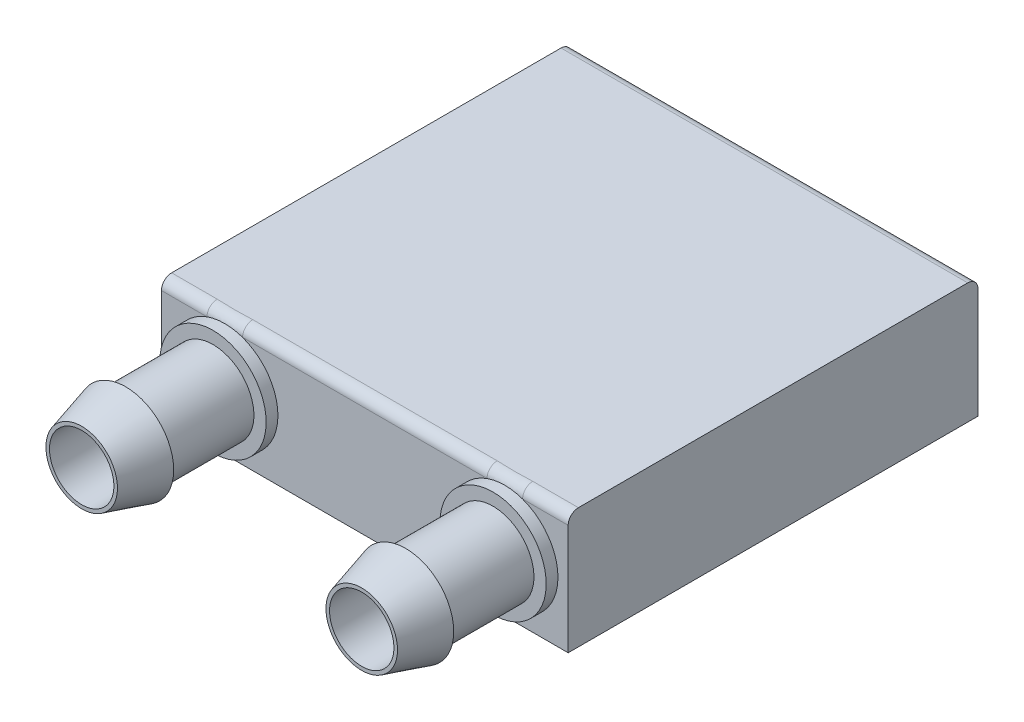
ISO-10303-21;
HEADER;
FILE_DESCRIPTION(('STEP AP214'),'2;1');
FILE_NAME('part.step','',(''),(''),'','','');
FILE_SCHEMA(('AUTOMOTIVE_DESIGN { 1 0 10303 214 1 1 1 1 }'));
ENDSEC;
DATA;
#1=APPLICATION_CONTEXT('core data for automotive mechanical design processes');
#2=APPLICATION_PROTOCOL_DEFINITION('international standard','automotive_design',2000,#1);
#3=PRODUCT_CONTEXT('',#1,'mechanical');
#4=PRODUCT('Part','Part','',(#3));
#5=PRODUCT_RELATED_PRODUCT_CATEGORY('part','',(#4));
#6=PRODUCT_DEFINITION_FORMATION('','',#4);
#7=PRODUCT_DEFINITION_CONTEXT('part definition',#1,'design');
#8=PRODUCT_DEFINITION('design','',#6,#7);
#9=PRODUCT_DEFINITION_SHAPE('','',#8);
#10=(LENGTH_UNIT() NAMED_UNIT(*) SI_UNIT(.MILLI.,.METRE.));
#11=(NAMED_UNIT(*) PLANE_ANGLE_UNIT() SI_UNIT($,.RADIAN.));
#12=(NAMED_UNIT(*) SI_UNIT($,.STERADIAN.) SOLID_ANGLE_UNIT());
#13=UNCERTAINTY_MEASURE_WITH_UNIT(LENGTH_MEASURE(1.E-05),#10,'distance_accuracy_value','');
#14=(GEOMETRIC_REPRESENTATION_CONTEXT(3) GLOBAL_UNCERTAINTY_ASSIGNED_CONTEXT((#13)) GLOBAL_UNIT_ASSIGNED_CONTEXT((#10,
#11,#12)) REPRESENTATION_CONTEXT('',''));
#15=CARTESIAN_POINT('',(0.,0.,0.));
#16=DIRECTION('',(0.,0.,1.));
#17=DIRECTION('',(1.,0.,0.));
#18=AXIS2_PLACEMENT_3D('',#15,#16,#17);
#19=CARTESIAN_POINT('',(0.,11.8,0.));
#20=DIRECTION('',(1.,0.,0.));
#21=DIRECTION('',(0.,0.,1.));
#22=AXIS2_PLACEMENT_3D('',#19,#20,#21);
#23=PLANE('',#22);
#24=DIRECTION('',(0.,-1.,0.));
#25=VECTOR('',#24,1.);
#26=CARTESIAN_POINT('',(0.,11.8,0.));
#27=LINE('',#26,#25);
#28=CARTESIAN_POINT('',(0.,10.8,0.));
#29=VERTEX_POINT('',#28);
#30=CARTESIAN_POINT('',(0.,0.,0.));
#31=VERTEX_POINT('',#30);
#32=EDGE_CURVE('E128',#29,#31,#27,.T.);
#33=ORIENTED_EDGE('',*,*,#32,.T.);
#34=DIRECTION('',(0.,0.,-1.));
#35=VECTOR('',#34,1.);
#36=CARTESIAN_POINT('',(0.,0.,0.));
#37=LINE('',#36,#35);
#38=CARTESIAN_POINT('',(0.,0.,40.1));
#39=VERTEX_POINT('',#38);
#40=EDGE_CURVE('E134',#39,#31,#37,.T.);
#41=ORIENTED_EDGE('',*,*,#40,.F.);
#42=DIRECTION('',(0.,-1.,0.));
#43=VECTOR('',#42,1.);
#44=CARTESIAN_POINT('',(0.,11.8,40.1));
#45=LINE('',#44,#43);
#46=CARTESIAN_POINT('',(0.,10.8,40.1));
#47=VERTEX_POINT('',#46);
#48=EDGE_CURVE('E265',#47,#39,#45,.T.);
#49=ORIENTED_EDGE('',*,*,#48,.F.);
#50=CARTESIAN_POINT('',(0.,10.8,39.1));
#51=DIRECTION('',(-1.,0.,0.));
#52=DIRECTION('',(0.,0.,1.));
#53=AXIS2_PLACEMENT_3D('',#50,#51,#52);
#54=CIRCLE('',#53,1.);
#55=CARTESIAN_POINT('',(0.,11.8,39.1));
#56=VERTEX_POINT('',#55);
#57=EDGE_CURVE('E279',#56,#47,#54,.F.);
#58=ORIENTED_EDGE('',*,*,#57,.F.);
#59=DIRECTION('',(0.,0.,-1.));
#60=VECTOR('',#59,1.);
#61=CARTESIAN_POINT('',(0.,11.8,0.));
#62=LINE('',#61,#60);
#63=CARTESIAN_POINT('',(0.,11.8,1.));
#64=VERTEX_POINT('',#63);
#65=EDGE_CURVE('E266',#56,#64,#62,.T.);
#66=ORIENTED_EDGE('',*,*,#65,.T.);
#67=CARTESIAN_POINT('',(0.,10.8,1.));
#68=DIRECTION('',(-1.,0.,0.));
#69=DIRECTION('',(0.,0.,1.));
#70=AXIS2_PLACEMENT_3D('',#67,#68,#69);
#71=CIRCLE('',#70,1.);
#72=EDGE_CURVE('E147',#29,#64,#71,.F.);
#73=ORIENTED_EDGE('',*,*,#72,.F.);
#74=EDGE_LOOP('',(#33,#41,#49,#58,#66,#73));
#75=FACE_BOUND('',#74,.T.);
#76=ADVANCED_FACE('F37',(#75),#23,.F.);
#77=CARTESIAN_POINT('',(0.,11.8,0.));
#78=DIRECTION('',(0.,0.,1.));
#79=DIRECTION('',(-1.,0.,0.));
#80=AXIS2_PLACEMENT_3D('',#77,#78,#79);
#81=PLANE('',#80);
#82=DIRECTION('',(0.,-1.,0.));
#83=VECTOR('',#82,1.);
#84=CARTESIAN_POINT('',(39.8,11.8,0.));
#85=LINE('',#84,#83);
#86=CARTESIAN_POINT('',(39.8,10.8,0.));
#87=VERTEX_POINT('',#86);
#88=CARTESIAN_POINT('',(39.8,0.,0.));
#89=VERTEX_POINT('',#88);
#90=EDGE_CURVE('E130',#87,#89,#85,.T.);
#91=ORIENTED_EDGE('',*,*,#90,.T.);
#92=DIRECTION('',(1.,0.,0.));
#93=VECTOR('',#92,1.);
#94=CARTESIAN_POINT('',(0.,0.,0.));
#95=LINE('',#94,#93);
#96=EDGE_CURVE('E123',#31,#89,#95,.T.);
#97=ORIENTED_EDGE('',*,*,#96,.F.);
#98=ORIENTED_EDGE('',*,*,#32,.F.);
#99=DIRECTION('',(1.,0.,0.));
#100=VECTOR('',#99,1.);
#101=CARTESIAN_POINT('',(0.,10.8,0.));
#102=LINE('',#101,#100);
#103=EDGE_CURVE('E282',#87,#29,#102,.F.);
#104=ORIENTED_EDGE('',*,*,#103,.F.);
#105=EDGE_LOOP('',(#91,#97,#98,#104));
#106=FACE_BOUND('',#105,.T.);
#107=ADVANCED_FACE('F125',(#106),#81,.F.);
#108=CARTESIAN_POINT('',(39.8,11.8,0.));
#109=DIRECTION('',(-1.,0.,0.));
#110=DIRECTION('',(0.,0.,-1.));
#111=AXIS2_PLACEMENT_3D('',#108,#109,#110);
#112=PLANE('',#111);
#113=DIRECTION('',(0.,0.,1.));
#114=VECTOR('',#113,1.);
#115=CARTESIAN_POINT('',(39.8,11.8,0.));
#116=LINE('',#115,#114);
#117=CARTESIAN_POINT('',(39.8,11.8,1.));
#118=VERTEX_POINT('',#117);
#119=CARTESIAN_POINT('',(39.8,11.8,39.1));
#120=VERTEX_POINT('',#119);
#121=EDGE_CURVE('E260',#118,#120,#116,.T.);
#122=ORIENTED_EDGE('',*,*,#121,.T.);
#123=CARTESIAN_POINT('',(39.8,10.8,39.1));
#124=DIRECTION('',(1.,0.,0.));
#125=DIRECTION('',(0.,0.,-1.));
#126=AXIS2_PLACEMENT_3D('',#123,#124,#125);
#127=CIRCLE('',#126,1.);
#128=CARTESIAN_POINT('',(39.8,10.8,40.1));
#129=VERTEX_POINT('',#128);
#130=EDGE_CURVE('E263',#129,#120,#127,.F.);
#131=ORIENTED_EDGE('',*,*,#130,.F.);
#132=DIRECTION('',(0.,-1.,0.));
#133=VECTOR('',#132,1.);
#134=CARTESIAN_POINT('',(39.8,11.8,40.1));
#135=LINE('',#134,#133);
#136=CARTESIAN_POINT('',(39.8,0.,40.1));
#137=VERTEX_POINT('',#136);
#138=EDGE_CURVE('E153',#129,#137,#135,.T.);
#139=ORIENTED_EDGE('',*,*,#138,.T.);
#140=DIRECTION('',(0.,0.,1.));
#141=VECTOR('',#140,1.);
#142=CARTESIAN_POINT('',(39.8,0.,0.));
#143=LINE('',#142,#141);
#144=EDGE_CURVE('E133',#89,#137,#143,.T.);
#145=ORIENTED_EDGE('',*,*,#144,.F.);
#146=ORIENTED_EDGE('',*,*,#90,.F.);
#147=CARTESIAN_POINT('',(39.8,10.8,1.));
#148=DIRECTION('',(1.,0.,0.));
#149=DIRECTION('',(0.,0.,-1.));
#150=AXIS2_PLACEMENT_3D('',#147,#148,#149);
#151=CIRCLE('',#150,1.);
#152=EDGE_CURVE('E264',#118,#87,#151,.F.);
#153=ORIENTED_EDGE('',*,*,#152,.F.);
#154=EDGE_LOOP('',(#122,#131,#139,#145,#146,#153));
#155=FACE_BOUND('',#154,.T.);
#156=ADVANCED_FACE('F248',(#155),#112,.F.);
#157=CARTESIAN_POINT('',(0.,11.8,40.1));
#158=DIRECTION('',(0.,0.,-1.));
#159=DIRECTION('',(1.,0.,0.));
#160=AXIS2_PLACEMENT_3D('',#157,#158,#159);
#161=PLANE('',#160);
#162=ORIENTED_EDGE('',*,*,#48,.T.);
#163=DIRECTION('',(-1.,0.,0.));
#164=VECTOR('',#163,1.);
#165=CARTESIAN_POINT('',(0.,0.,40.1));
#166=LINE('',#165,#164);
#167=EDGE_CURVE('E138',#137,#39,#166,.T.);
#168=ORIENTED_EDGE('',*,*,#167,.F.);
#169=ORIENTED_EDGE('',*,*,#138,.F.);
#170=DIRECTION('',(-1.,0.,0.));
#171=VECTOR('',#170,1.);
#172=CARTESIAN_POINT('',(0.,10.8,40.1));
#173=LINE('',#172,#171);
#174=CARTESIAN_POINT('',(35.3406895185529,10.8,40.1));
#175=VERTEX_POINT('',#174);
#176=EDGE_CURVE('E276',#175,#129,#173,.F.);
#177=ORIENTED_EDGE('',*,*,#176,.F.);
#178=CARTESIAN_POINT('',(33.6,5.9,40.1));
#179=DIRECTION('',(0.,0.,1.));
#180=DIRECTION('',(1.,0.,0.));
#181=AXIS2_PLACEMENT_3D('',#178,#179,#180);
#182=CIRCLE('',#181,5.2);
#183=CARTESIAN_POINT('',(31.8593104814471,10.8,40.1));
#184=VERTEX_POINT('',#183);
#185=EDGE_CURVE('E157',#175,#184,#182,.F.);
#186=ORIENTED_EDGE('',*,*,#185,.T.);
#187=DIRECTION('',(-1.,0.,0.));
#188=VECTOR('',#187,1.);
#189=CARTESIAN_POINT('',(0.,10.8,40.1));
#190=LINE('',#189,#188);
#191=CARTESIAN_POINT('',(7.94068951855292,10.8,40.1));
#192=VERTEX_POINT('',#191);
#193=EDGE_CURVE('E51',#192,#184,#190,.F.);
#194=ORIENTED_EDGE('',*,*,#193,.F.);
#195=CARTESIAN_POINT('',(6.2,5.9,40.1));
#196=DIRECTION('',(0.,0.,1.));
#197=DIRECTION('',(1.,0.,0.));
#198=AXIS2_PLACEMENT_3D('',#195,#196,#197);
#199=CIRCLE('',#198,5.2);
#200=CARTESIAN_POINT('',(4.45931048144708,10.8,40.1));
#201=VERTEX_POINT('',#200);
#202=EDGE_CURVE('E148',#192,#201,#199,.F.);
#203=ORIENTED_EDGE('',*,*,#202,.T.);
#204=DIRECTION('',(-1.,0.,0.));
#205=VECTOR('',#204,1.);
#206=CARTESIAN_POINT('',(0.,10.8,40.1));
#207=LINE('',#206,#205);
#208=EDGE_CURVE('E11',#47,#201,#207,.F.);
#209=ORIENTED_EDGE('',*,*,#208,.F.);
#210=EDGE_LOOP('',(#162,#168,#169,#177,#186,#194,#203,#209));
#211=FACE_BOUND('',#210,.T.);
#212=ADVANCED_FACE('F184',(#211),#161,.F.);
#213=CARTESIAN_POINT('',(0.,11.8,0.));
#214=DIRECTION('',(0.,-1.,0.));
#215=DIRECTION('',(0.,0.,1.));
#216=AXIS2_PLACEMENT_3D('',#213,#214,#215);
#217=PLANE('',#216);
#218=ORIENTED_EDGE('',*,*,#65,.F.);
#219=DIRECTION('',(-1.,0.,0.));
#220=VECTOR('',#219,1.);
#221=CARTESIAN_POINT('',(0.,11.8,39.1));
#222=LINE('',#221,#220);
#223=CARTESIAN_POINT('',(4.45931048144708,11.8,39.1));
#224=VERTEX_POINT('',#223);
#225=EDGE_CURVE('E162',#224,#56,#222,.T.);
#226=ORIENTED_EDGE('',*,*,#225,.F.);
#227=CARTESIAN_POINT('',(9.0376715437162,11.8,39.2133104201227));
#228=CARTESIAN_POINT('',(8.65141093451701,11.8,40.6914063176011));
#229=CARTESIAN_POINT('',(8.80595906966206,10.3998863682593,40.1));
#230=CARTESIAN_POINT('',(8.97694603446269,11.8,39.1974631160981));
#231=CARTESIAN_POINT('',(8.63811264927779,11.8,40.6432628672062));
#232=CARTESIAN_POINT('',(8.7642060606564,10.4240692506874,40.1));
#233=CARTESIAN_POINT('',(8.91570219770932,11.8,39.1838071876819));
#234=CARTESIAN_POINT('',(8.6172464416421,11.8,40.5966849765277));
#235=CARTESIAN_POINT('',(8.72106978727092,10.4482708643145,40.1));
#236=CARTESIAN_POINT('',(8.79256859558231,11.8,39.1602493571085));
#237=CARTESIAN_POINT('',(8.56400567381693,11.8,40.5093965473498));
#238=CARTESIAN_POINT('',(8.63222984030575,10.496390027004,40.1));
#239=CARTESIAN_POINT('',(8.73067972796566,11.8,39.1503428086633));
#240=CARTESIAN_POINT('',(8.53198553045712,11.8,40.468383395448));
#241=CARTESIAN_POINT('',(8.58652942546641,10.520307891834,40.1));
#242=CARTESIAN_POINT('',(8.5450130966726,11.8,39.1253391762808));
#243=CARTESIAN_POINT('',(8.42535389075237,11.8,40.3563215495721));
#244=CARTESIAN_POINT('',(8.44618129163544,10.5910125580634,40.1));
#245=CARTESIAN_POINT('',(8.42063169913544,11.8,39.1148150330448));
#246=CARTESIAN_POINT('',(8.33763859631253,11.8,40.2907331492449));
#247=CARTESIAN_POINT('',(8.34787294667272,10.636994035547,40.1));
#248=CARTESIAN_POINT('',(8.17219260462,11.8,39.1020597674168));
#249=CARTESIAN_POINT('',(8.14421998783213,11.8,40.1803396012739));
#250=CARTESIAN_POINT('',(8.14297219995413,10.7246473617916,40.1));
#251=CARTESIAN_POINT('',(8.04813650751989,11.8,39.0997864895952));
#252=CARTESIAN_POINT('',(8.03874102534524,11.8,40.1340441664148));
#253=CARTESIAN_POINT('',(8.03642475680136,10.7663400568957,40.1));
#254=CARTESIAN_POINT('',(7.79988799433525,11.8,39.1002444128887));
#255=CARTESIAN_POINT('',(7.81724032429575,11.8,40.0570136559897));
#256=CARTESIAN_POINT('',(7.81528970217602,10.8441475617195,40.1));
#257=CARTESIAN_POINT('',(7.67569563348326,11.8,39.1029826937218));
#258=CARTESIAN_POINT('',(7.70074826289462,11.8,40.0254225233247));
#259=CARTESIAN_POINT('',(7.70069093672816,10.8802544022681,40.1));
#260=CARTESIAN_POINT('',(7.40864671766462,11.8,39.1113455617933));
#261=CARTESIAN_POINT('',(7.44427386844509,11.8,39.9702131402894));
#262=CARTESIAN_POINT('',(7.44680658137538,10.9502787004256,40.1));
#263=CARTESIAN_POINT('',(7.26580481575084,11.8,39.117343680815));
#264=CARTESIAN_POINT('',(7.30172781372068,11.8,39.9476384193112));
#265=CARTESIAN_POINT('',(7.30640689868977,10.9830414301924,40.1));
#266=CARTESIAN_POINT('',(6.98017752117187,11.8,39.1289136041272));
#267=CARTESIAN_POINT('',(7.01290458139972,11.8,39.9134878291368));
#268=CARTESIAN_POINT('',(7.01873885705423,11.0372234312982,40.1));
#269=CARTESIAN_POINT('',(6.83739213936757,11.8,39.1344856356847));
#270=CARTESIAN_POINT('',(6.86528897728117,11.8,39.9014966991232));
#271=CARTESIAN_POINT('',(6.87147422816968,11.0586487863977,40.1));
#272=CARTESIAN_POINT('',(6.55164236334967,11.8,39.1426885125737));
#273=CARTESIAN_POINT('',(6.56887488983361,11.8,39.8853881779599));
#274=CARTESIAN_POINT('',(6.57280875177619,11.0887892077058,40.1));
#275=CARTESIAN_POINT('',(6.40867791347427,11.8,39.1453176767416));
#276=CARTESIAN_POINT('',(6.418594381702,11.8,39.8811016243282));
#277=CARTESIAN_POINT('',(6.42140559059565,11.0974970096586,40.1));
#278=CARTESIAN_POINT('',(6.12270966973315,11.8,39.1465271735554));
#279=CARTESIAN_POINT('',(6.11920792417805,11.8,39.8790842405917));
#280=CARTESIAN_POINT('',(6.1180136011455,11.1015684432353,40.1));
#281=CARTESIAN_POINT('',(5.97970587319456,11.8,39.1451070114759));
#282=CARTESIAN_POINT('',(5.96856596061771,11.8,39.8813335991972));
#283=CARTESIAN_POINT('',(5.96602470357921,11.0969304443385,40.1));
#284=CARTESIAN_POINT('',(5.64839902973213,11.8,39.1377579045133));
#285=CARTESIAN_POINT('',(5.62291588711351,11.8,39.8946918658661));
#286=CARTESIAN_POINT('',(5.61732765651071,11.0710654484402,40.1));
#287=CARTESIAN_POINT('',(5.46013154089748,11.8,39.1305403926206));
#288=CARTESIAN_POINT('',(5.42659397312623,11.8,39.9086192322347));
#289=CARTESIAN_POINT('',(5.42174529952047,11.0450382663129,40.1));
#290=CARTESIAN_POINT('',(5.08368004178434,11.8,39.1153032072669));
#291=CARTESIAN_POINT('',(5.04604417058593,11.8,39.9540226263979));
#292=CARTESIAN_POINT('',(5.04283282477971,10.9732855743908,40.1));
#293=CARTESIAN_POINT('',(4.89549602300846,11.8,39.1072837630752));
#294=CARTESIAN_POINT('',(4.8587343840025,11.8,39.9864439667343));
#295=CARTESIAN_POINT('',(4.85949923001776,10.9275656823723,40.1));
#296=CARTESIAN_POINT('',(4.61384422981861,11.8,39.1009052409067));
#297=CARTESIAN_POINT('',(4.59734681522365,11.8,40.054017069443));
#298=CARTESIAN_POINT('',(4.59784145811496,10.8478629392358,40.1));
#299=CARTESIAN_POINT('',(4.52046147812334,11.8,39.0997140696696));
#300=CARTESIAN_POINT('',(4.51177336396614,11.8,40.0803585410739));
#301=CARTESIAN_POINT('',(4.51317922174569,10.8195855292717,40.1));
#302=CARTESIAN_POINT('',(4.33374989980949,11.8,39.1004040660646));
#303=CARTESIAN_POINT('',(4.34743584860777,11.8,40.1412083903224));
#304=CARTESIAN_POINT('',(4.34842797917534,10.7599735819644,40.1));
#305=CARTESIAN_POINT('',(4.24042107140902,11.8,39.102283567995));
#306=CARTESIAN_POINT('',(4.26849859528199,11.8,40.1761069638796));
#307=CARTESIAN_POINT('',(4.2683365179224,10.7286407107397,40.1));
#308=CARTESIAN_POINT('',(4.05351342503376,11.8,39.1104617477959));
#309=CARTESIAN_POINT('',(4.11995578585235,11.8,40.255906772344));
#310=CARTESIAN_POINT('',(4.11271280836083,10.6634412084336,40.1));
#311=CARTESIAN_POINT('',(3.95993526952808,11.8,39.1167794868437));
#312=CARTESIAN_POINT('',(4.05041140508346,11.8,40.3014127733853));
#313=CARTESIAN_POINT('',(4.03720175700708,10.6295642134738,40.1));
#314=CARTESIAN_POINT('',(3.77322533657002,11.8,39.1355392468181));
#315=CARTESIAN_POINT('',(3.92585742166498,11.8,40.4035353078189));
#316=CARTESIAN_POINT('',(3.89135408028781,10.5601209394778,40.1));
#317=CARTESIAN_POINT('',(3.68009482016295,11.8,39.1479934462363));
#318=CARTESIAN_POINT('',(3.87123499028958,11.8,40.4609379374579));
#319=CARTESIAN_POINT('',(3.82102806559466,10.5245514287966,40.1));
#320=CARTESIAN_POINT('',(3.58752206315573,11.8,39.1643505899244));
#321=CARTESIAN_POINT('',(3.82866427250931,11.8,40.5231845779235));
#322=CARTESIAN_POINT('',(3.75356483800436,10.4885678591638,40.1));
#323=(BOUNDED_SURFACE() B_SPLINE_SURFACE(3,2,((#227,#228,#229),(#230,#231,#232),(#233,#234,
#235),(#236,#237,#238),(#239,#240,#241),(#242,#243,#244),(#245,#246,#247),(#248,#249,#250),
(#251,#252,#253),(#254,#255,#256),(#257,#258,#259),(#260,#261,#262),(#263,#264,#265),(#266,#267,
#268),(#269,#270,#271),(#272,#273,#274),(#275,#276,#277),(#278,#279,#280),(#281,#282,#283),
(#284,#285,#286),(#287,#288,#289),(#290,#291,#292),(#293,#294,#295),(#296,#297,#298),(#299,#300,
#301),(#302,#303,#304),(#305,#306,#307),(#308,#309,#310),(#311,#312,#313),(#314,#315,#316),
(#317,#318,#319),(#320,#321,#322)),.UNSPECIFIED.,.F.,.F.,.F.) B_SPLINE_SURFACE_WITH_KNOTS((4,2,
2,2,2,2,2,2,2,2,2,2,2,2,2,4),(3,3),(0.,0.188160562325025,0.376087183788249,0.75008933411585,
1.12217791635404,1.49479254567855,1.92369642323129,2.35236991223196,2.78128816353904,
3.21025882008101,3.77545021918978,4.3404804917574,4.62061503468715,4.90059766769387,
5.18179016989228,5.46354299157045),(0.,1.),
.UNSPECIFIED.) GEOMETRIC_REPRESENTATION_ITEM() RATIONAL_B_SPLINE_SURFACE(((1.,0.547670689492929,
1.),(1.,0.5587094250952,1.),(1.,0.569423565319314,1.),(1.,0.590171576037615,1.),(1.,
0.600206275752195,1.),(1.,0.629189184441402,1.),(1.,0.647125115784685,1.),(1.,0.680143283589719,
1.),(1.,0.695239651344927,1.),(1.,0.722676995853412,1.),(1.,0.73501404694818,1.),(1.,
0.758483860589393,1.),(1.,0.769153155053994,1.),(1.,0.786566890945051,1.),(1.,0.793313437553765,
1.),(1.,0.802756108123165,1.),(1.,0.805449917189955,1.),(1.,0.806711815618231,1.),(1.,
0.80527940085904,1.),(1.,0.79721822527018,1.),(1.,0.789083795491082,1.),(1.,0.766012291983872,
1.),(1.,0.751077158235992,1.),(1.,0.723885981241749,1.),(1.,0.71407607862851,1.),(1.,
0.692891977464714,1.),(1.,0.681518630077253,1.),(1.,0.657168011607361,1.),(1.,0.644184021977453,
1.),(1.,0.616643146010207,1.),(1.,0.602083176988465,1.),(1.,0.586757129979617,1.))) REPRESENTATION_ITEM('') SURFACE());
#324=CARTESIAN_POINT('',(9.0376715437162,11.8,39.2133104201227));
#325=CARTESIAN_POINT('',(8.97694603446269,11.8,39.1974631160981));
#326=CARTESIAN_POINT('',(8.91570219770932,11.8,39.1838071876819));
#327=CARTESIAN_POINT('',(8.79256859558231,11.8,39.1602493571085));
#328=CARTESIAN_POINT('',(8.73067972796566,11.8,39.1503428086633));
#329=CARTESIAN_POINT('',(8.5450130966726,11.8,39.1253391762808));
#330=CARTESIAN_POINT('',(8.42063169913544,11.8,39.1148150330448));
#331=CARTESIAN_POINT('',(8.17219260462,11.8,39.1020597674168));
#332=CARTESIAN_POINT('',(8.04813650751989,11.8,39.0997864895952));
#333=CARTESIAN_POINT('',(7.79988799433525,11.8,39.1002444128887));
#334=CARTESIAN_POINT('',(7.67569563348326,11.8,39.1029826937218));
#335=CARTESIAN_POINT('',(7.40864671766462,11.8,39.1113455617933));
#336=CARTESIAN_POINT('',(7.26580481575084,11.8,39.117343680815));
#337=CARTESIAN_POINT('',(6.98017752117187,11.8,39.1289136041271));
#338=CARTESIAN_POINT('',(6.83739213936757,11.8,39.1344856356847));
#339=CARTESIAN_POINT('',(6.55164236334967,11.8,39.1426885125737));
#340=CARTESIAN_POINT('',(6.40867791347427,11.8,39.1453176767416));
#341=CARTESIAN_POINT('',(6.12270966973315,11.8,39.1465271735554));
#342=CARTESIAN_POINT('',(5.97970587319456,11.8,39.1451070114758));
#343=CARTESIAN_POINT('',(5.64839902973213,11.8,39.1377579045133));
#344=CARTESIAN_POINT('',(5.46013154089748,11.8,39.1305403926206));
#345=CARTESIAN_POINT('',(5.08368004178433,11.8,39.1153032072669));
#346=CARTESIAN_POINT('',(4.89549602300846,11.8,39.1072837630752));
#347=CARTESIAN_POINT('',(4.61384422981861,11.8,39.1009052409067));
#348=CARTESIAN_POINT('',(4.52046147812334,11.8,39.0997140696695));
#349=CARTESIAN_POINT('',(4.33374989980949,11.8,39.1004040660646));
#350=CARTESIAN_POINT('',(4.24042107140902,11.8,39.102283567995));
#351=CARTESIAN_POINT('',(4.05351342503376,11.8,39.110461747796));
#352=CARTESIAN_POINT('',(3.95993526952808,11.8,39.1167794868437));
#353=CARTESIAN_POINT('',(3.77322533657001,11.8,39.1355392468181));
#354=CARTESIAN_POINT('',(3.68009482016295,11.8,39.1479934462363));
#355=CARTESIAN_POINT('',(3.58752206315573,11.8,39.1643505899244));
#356=B_SPLINE_CURVE_WITH_KNOTS('',3,(#324,#325,#326,#327,#328,#329,#330,#331,#332,#333,#334,
#335,#336,#337,#338,#339,#340,#341,#342,#343,#344,#345,#346,#347,#348,#349,#350,#351,#352,#353,
#354,#355),.UNSPECIFIED.,.F.,.F.,(4,2,2,2,2,2,2,2,2,2,2,2,2,2,2,4),(0.,0.188160562325025,
0.376087183788249,0.75008933411585,1.12217791635404,1.49479254567855,1.92369642323129,
2.35236991223196,2.78128816353904,3.21025882008101,3.77545021918978,4.3404804917574,
4.62061503468715,4.90059766769387,5.18179016989228,5.46354299157045),.UNSPECIFIED.);
#357=CARTESIAN_POINT('',(7.94068951855292,11.8,39.1));
#358=VERTEX_POINT('',#357);
#359=EDGE_CURVE('E164',#358,#224,#356,.T.);
#360=ORIENTED_EDGE('',*,*,#359,.F.);
#361=DIRECTION('',(-1.,0.,0.));
#362=VECTOR('',#361,1.);
#363=CARTESIAN_POINT('',(0.,11.8,39.1));
#364=LINE('',#363,#362);
#365=CARTESIAN_POINT('',(31.8593104814471,11.8,39.1));
#366=VERTEX_POINT('',#365);
#367=EDGE_CURVE('E173',#366,#358,#364,.T.);
#368=ORIENTED_EDGE('',*,*,#367,.F.);
#369=CARTESIAN_POINT('',(36.4376715437162,11.8,39.2133104201227));
#370=CARTESIAN_POINT('',(36.0514109053202,11.8,40.6914062854075));
#371=CARTESIAN_POINT('',(36.2059590471005,10.3998863813251,40.1));
#372=CARTESIAN_POINT('',(36.3769460344585,11.8,39.1974631160973));
#373=CARTESIAN_POINT('',(36.0381126387893,11.8,40.643262855771));
#374=CARTESIAN_POINT('',(36.1642060523448,10.4240692555008,40.1));
#375=CARTESIAN_POINT('',(36.3157021977009,11.8,39.1838071876804));
#376=CARTESIAN_POINT('',(36.0172464388454,11.8,40.5966849735014));
#377=CARTESIAN_POINT('',(36.1210697849913,10.4482708656346,40.1));
#378=CARTESIAN_POINT('',(36.1925685955645,11.8,39.1602493571056));
#379=CARTESIAN_POINT('',(35.9640056764479,11.8,40.509396550161));
#380=CARTESIAN_POINT('',(36.0322298425646,10.4963900256952,40.1));
#381=CARTESIAN_POINT('',(36.1306797279427,11.8,39.1503428086598));
#382=CARTESIAN_POINT('',(35.9319855313383,11.8,40.4683833963861));
#383=CARTESIAN_POINT('',(35.9865294262411,10.5203078913845,40.1));
#384=CARTESIAN_POINT('',(35.9450130966358,11.8,39.1253391762767));
#385=CARTESIAN_POINT('',(35.8253538891049,11.8,40.3563215478172));
#386=CARTESIAN_POINT('',(35.8461812900325,10.591012558989,40.1));
#387=CARTESIAN_POINT('',(35.8206316990899,11.8,39.1148150330412));
#388=CARTESIAN_POINT('',(35.7376385958731,11.8,40.2907331487825));
#389=CARTESIAN_POINT('',(35.7478729462154,10.6369940358075,40.1));
#390=CARTESIAN_POINT('',(35.5721926045747,11.8,39.1020597674157));
#391=CARTESIAN_POINT('',(35.5442199881479,11.8,40.1803396016544));
#392=CARTESIAN_POINT('',(35.5429722003345,10.7246473615643,40.1));
#393=CARTESIAN_POINT('',(35.4481365074836,11.8,39.0997864895949));
#394=CARTESIAN_POINT('',(35.438741025402,11.8,40.1340441665053));
#395=CARTESIAN_POINT('',(35.4364247568824,10.7663400568421,40.1));
#396=CARTESIAN_POINT('',(35.1998879943171,11.8,39.1002444128891));
#397=CARTESIAN_POINT('',(35.2172403242021,11.8,40.057013655889));
#398=CARTESIAN_POINT('',(35.2152897020463,10.8441475617902,40.1));
#399=CARTESIAN_POINT('',(35.0756956334742,11.8,39.1029826937221));
#400=CARTESIAN_POINT('',(35.1007482628657,11.8,40.0254225232962));
#401=CARTESIAN_POINT('',(35.1006909366875,10.8802544022891,40.1));
#402=CARTESIAN_POINT('',(34.8086467176646,11.8,39.1113455617933));
#403=CARTESIAN_POINT('',(34.8442738684641,11.8,39.9702131403183));
#404=CARTESIAN_POINT('',(34.8468065814125,10.9502787004041,40.1));
#405=CARTESIAN_POINT('',(34.6658048157509,11.8,39.117343680815));
#406=CARTESIAN_POINT('',(34.7017278137248,11.8,39.9476384193187));
#407=CARTESIAN_POINT('',(34.7064068986992,10.9830414301867,40.1));
#408=CARTESIAN_POINT('',(34.3801775211719,11.8,39.1289136041271));
#409=CARTESIAN_POINT('',(34.4129045813957,11.8,39.9134878291294));
#410=CARTESIAN_POINT('',(34.4187388570437,11.0372234313041,40.1));
#411=CARTESIAN_POINT('',(34.2373921393676,11.8,39.1344856356847));
#412=CARTESIAN_POINT('',(34.2652889772802,11.8,39.9014966991213));
#413=CARTESIAN_POINT('',(34.2714742281667,11.0586487863993,40.1));
#414=CARTESIAN_POINT('',(33.9516423633497,11.8,39.1426885125737));
#415=CARTESIAN_POINT('',(33.9688748898342,11.8,39.8853881779618));
#416=CARTESIAN_POINT('',(33.9728087517789,11.0887892077042,40.1));
#417=CARTESIAN_POINT('',(33.8086779134743,11.8,39.1453176767416));
#418=CARTESIAN_POINT('',(33.8185943817021,11.8,39.8811016243287));
#419=CARTESIAN_POINT('',(33.8214055905964,11.0974970096581,40.1));
#420=CARTESIAN_POINT('',(33.5227096697332,11.8,39.1465271735554));
#421=CARTESIAN_POINT('',(33.519207924178,11.8,39.8790842405912));
#422=CARTESIAN_POINT('',(33.5180136011448,11.1015684432358,40.1));
#423=CARTESIAN_POINT('',(33.3797058731946,11.8,39.1451070114759));
#424=CARTESIAN_POINT('',(33.3685659606177,11.8,39.8813335991971));
#425=CARTESIAN_POINT('',(33.366024703579,11.0969304443387,40.1));
#426=CARTESIAN_POINT('',(33.0483990297321,11.8,39.1377579045133));
#427=CARTESIAN_POINT('',(33.0229158871134,11.8,39.8946918658663));
#428=CARTESIAN_POINT('',(33.017327656511,11.0710654484401,40.1));
#429=CARTESIAN_POINT('',(32.8601315408975,11.8,39.1305403926206));
#430=CARTESIAN_POINT('',(32.8265939731261,11.8,39.9086192322347));
#431=CARTESIAN_POINT('',(32.8217452995204,11.0450382663129,40.1));
#432=CARTESIAN_POINT('',(32.4836800417843,11.8,39.1153032072669));
#433=CARTESIAN_POINT('',(32.446044170586,11.8,39.9540226263979));
#434=CARTESIAN_POINT('',(32.4428328247797,10.9732855743908,40.1));
#435=CARTESIAN_POINT('',(32.2954960230085,11.8,39.1072837630752));
#436=CARTESIAN_POINT('',(32.2587343840027,11.8,39.9864439667343));
#437=CARTESIAN_POINT('',(32.259499230018,10.9275656823724,40.1));
#438=CARTESIAN_POINT('',(32.0138442298186,11.8,39.1009052409067));
#439=CARTESIAN_POINT('',(31.9973468152238,11.8,40.054017069443));
#440=CARTESIAN_POINT('',(31.9978414581151,10.8478629392358,40.1));
#441=CARTESIAN_POINT('',(31.9204614781234,11.8,39.0997140696696));
#442=CARTESIAN_POINT('',(31.9117733639662,11.8,40.0803585410739));
#443=CARTESIAN_POINT('',(31.9131792217457,10.8195855292717,40.1));
#444=CARTESIAN_POINT('',(31.7337498998095,11.8,39.1004040660646));
#445=CARTESIAN_POINT('',(31.7474358486076,11.8,40.1412083903224));
#446=CARTESIAN_POINT('',(31.7484279791752,10.7599735819643,40.1));
#447=CARTESIAN_POINT('',(31.640421071409,11.8,39.1022835679949));
#448=CARTESIAN_POINT('',(31.6684985952818,11.8,40.1761069638797));
#449=CARTESIAN_POINT('',(31.6683365179222,10.7286407107396,40.1));
#450=CARTESIAN_POINT('',(31.4535134250338,11.8,39.1104617477959));
#451=CARTESIAN_POINT('',(31.5199557858521,11.8,40.2559067723442));
#452=CARTESIAN_POINT('',(31.5127128083606,10.6634412084335,40.1));
#453=CARTESIAN_POINT('',(31.3599352695281,11.8,39.1167794868437));
#454=CARTESIAN_POINT('',(31.4504114050832,11.8,40.3014127733855));
#455=CARTESIAN_POINT('',(31.4372017570069,10.6295642134737,40.1));
#456=CARTESIAN_POINT('',(31.17322533657,11.8,39.1355392468181));
#457=CARTESIAN_POINT('',(31.325857421665,11.8,40.4035353078189));
#458=CARTESIAN_POINT('',(31.2913540802878,10.5601209394779,40.1));
#459=CARTESIAN_POINT('',(31.080094820163,11.8,39.1479934462363));
#460=CARTESIAN_POINT('',(31.2712349902899,11.8,40.4609379374578));
#461=CARTESIAN_POINT('',(31.2210280655949,10.5245514287968,40.1));
#462=CARTESIAN_POINT('',(30.9875220631558,11.8,39.1643505899244));
#463=CARTESIAN_POINT('',(31.22866427251,11.8,40.5231845779229));
#464=CARTESIAN_POINT('',(31.1535648380049,10.4885678591641,40.1));
#465=(BOUNDED_SURFACE() B_SPLINE_SURFACE(3,2,((#369,#370,#371),(#372,#373,#374),(#375,#376,
#377),(#378,#379,#380),(#381,#382,#383),(#384,#385,#386),(#387,#388,#389),(#390,#391,#392),
(#393,#394,#395),(#396,#397,#398),(#399,#400,#401),(#402,#403,#404),(#405,#406,#407),(#408,#409,
#410),(#411,#412,#413),(#414,#415,#416),(#417,#418,#419),(#420,#421,#422),(#423,#424,#425),
(#426,#427,#428),(#429,#430,#431),(#432,#433,#434),(#435,#436,#437),(#438,#439,#440),(#441,#442,
#443),(#444,#445,#446),(#447,#448,#449),(#450,#451,#452),(#453,#454,#455),(#456,#457,#458),
(#459,#460,#461),(#462,#463,#464)),.UNSPECIFIED.,.F.,.F.,.F.) B_SPLINE_SURFACE_WITH_KNOTS((4,2,
2,2,2,2,2,2,2,2,2,2,2,2,2,4),(3,3),(0.,0.188160562337904,0.376087183816642,0.750089334170194,
1.12217791638126,1.49479254567852,1.92369642323125,2.35236991223194,2.78128816353902,
3.21025882008098,3.77545021918975,4.34048049175736,4.62061503468712,4.90059766769383,
5.18179016989224,5.46354299157041),(0.,1.),
.UNSPECIFIED.) GEOMETRIC_REPRESENTATION_ITEM() RATIONAL_B_SPLINE_SURFACE(((1.,0.547670695457186,
1.),(1.,0.55870942729237,1.),(1.,0.569423565921806,1.),(1.,0.590171575439976,1.),(1.,
0.600206275546622,1.),(1.,0.629189184863191,1.),(1.,0.647125115902453,1.),(1.,0.680143283484577,
1.),(1.,0.695239651319312,1.),(1.,0.722676995885094,1.),(1.,0.735014046957487,1.),(1.,
0.758483860579576,1.),(1.,0.769153155051393,1.),(1.,0.786566890947717,1.),(1.,0.793313437554485,
1.),(1.,0.802756108122454,1.),(1.,0.805449917189763,1.),(1.,0.806711815618423,1.),(1.,
0.8052794008591,1.),(1.,0.797218225270102,1.),(1.,0.789083795491052,1.),(1.,0.766012291983896,
1.),(1.,0.751077158236021,1.),(1.,0.723885981241762,1.),(1.,0.714076078628515,1.),(1.,
0.692891977464697,1.),(1.,0.681518630077224,1.),(1.,0.657168011607321,1.),(1.,0.644184021977412,
1.),(1.,0.61664314601021,1.),(1.,0.602083176988512,1.),(1.,0.586757129979744,1.))) REPRESENTATION_ITEM('') SURFACE());
#466=CARTESIAN_POINT('',(36.4376715437162,11.8,39.2133104201227));
#467=CARTESIAN_POINT('',(36.3769460344585,11.8,39.1974631160973));
#468=CARTESIAN_POINT('',(36.3157021977009,11.8,39.1838071876804));
#469=CARTESIAN_POINT('',(36.1925685955645,11.8,39.1602493571056));
#470=CARTESIAN_POINT('',(36.1306797279427,11.8,39.1503428086598));
#471=CARTESIAN_POINT('',(35.9450130966358,11.8,39.1253391762767));
#472=CARTESIAN_POINT('',(35.8206316990898,11.8,39.1148150330412));
#473=CARTESIAN_POINT('',(35.5721926045747,11.8,39.1020597674157));
#474=CARTESIAN_POINT('',(35.4481365074836,11.8,39.0997864895949));
#475=CARTESIAN_POINT('',(35.1998879943171,11.8,39.1002444128891));
#476=CARTESIAN_POINT('',(35.0756956334742,11.8,39.1029826937221));
#477=CARTESIAN_POINT('',(34.8086467176646,11.8,39.1113455617933));
#478=CARTESIAN_POINT('',(34.6658048157509,11.8,39.117343680815));
#479=CARTESIAN_POINT('',(34.3801775211719,11.8,39.1289136041271));
#480=CARTESIAN_POINT('',(34.2373921393676,11.8,39.1344856356847));
#481=CARTESIAN_POINT('',(33.9516423633497,11.8,39.1426885125737));
#482=CARTESIAN_POINT('',(33.8086779134743,11.8,39.1453176767416));
#483=CARTESIAN_POINT('',(33.5227096697332,11.8,39.1465271735554));
#484=CARTESIAN_POINT('',(33.3797058731946,11.8,39.1451070114758));
#485=CARTESIAN_POINT('',(33.0483990297321,11.8,39.1377579045133));
#486=CARTESIAN_POINT('',(32.8601315408975,11.8,39.1305403926206));
#487=CARTESIAN_POINT('',(32.4836800417843,11.8,39.1153032072669));
#488=CARTESIAN_POINT('',(32.2954960230085,11.8,39.1072837630752));
#489=CARTESIAN_POINT('',(32.0138442298186,11.8,39.1009052409067));
#490=CARTESIAN_POINT('',(31.9204614781234,11.8,39.0997140696695));
#491=CARTESIAN_POINT('',(31.7337498998095,11.8,39.1004040660646));
#492=CARTESIAN_POINT('',(31.640421071409,11.8,39.1022835679949));
#493=CARTESIAN_POINT('',(31.4535134250338,11.8,39.1104617477959));
#494=CARTESIAN_POINT('',(31.3599352695281,11.8,39.1167794868437));
#495=CARTESIAN_POINT('',(31.17322533657,11.8,39.1355392468181));
#496=CARTESIAN_POINT('',(31.080094820163,11.8,39.1479934462363));
#497=CARTESIAN_POINT('',(30.9875220631558,11.8,39.1643505899244));
#498=B_SPLINE_CURVE_WITH_KNOTS('',3,(#466,#467,#468,#469,#470,#471,#472,#473,#474,#475,#476,
#477,#478,#479,#480,#481,#482,#483,#484,#485,#486,#487,#488,#489,#490,#491,#492,#493,#494,#495,
#496,#497),.UNSPECIFIED.,.F.,.F.,(4,2,2,2,2,2,2,2,2,2,2,2,2,2,2,4),(0.,0.188160562337904,
0.376087183816642,0.750089334170194,1.12217791638126,1.49479254567852,1.92369642323125,
2.35236991223194,2.78128816353902,3.21025882008098,3.77545021918975,4.34048049175736,
4.62061503468712,4.90059766769383,5.18179016989224,5.46354299157041),.UNSPECIFIED.);
#499=CARTESIAN_POINT('',(35.3406895185529,11.8,39.1));
#500=VERTEX_POINT('',#499);
#501=EDGE_CURVE('E298',#500,#366,#498,.T.);
#502=ORIENTED_EDGE('',*,*,#501,.F.);
#503=DIRECTION('',(-1.,0.,0.));
#504=VECTOR('',#503,1.);
#505=CARTESIAN_POINT('',(0.,11.8,39.1));
#506=LINE('',#505,#504);
#507=EDGE_CURVE('E300',#120,#500,#506,.T.);
#508=ORIENTED_EDGE('',*,*,#507,.F.);
#509=ORIENTED_EDGE('',*,*,#121,.F.);
#510=DIRECTION('',(1.,0.,0.));
#511=VECTOR('',#510,1.);
#512=CARTESIAN_POINT('',(0.,11.8,1.));
#513=LINE('',#512,#511);
#514=EDGE_CURVE('E306',#64,#118,#513,.T.);
#515=ORIENTED_EDGE('',*,*,#514,.F.);
#516=EDGE_LOOP('',(#218,#226,#360,#368,#502,#508,#509,#515));
#517=FACE_BOUND('',#516,.T.);
#518=ADVANCED_FACE('F179',(#517),#217,.F.);
#519=CARTESIAN_POINT('',(0.,0.,0.));
#520=DIRECTION('',(0.,-1.,0.));
#521=DIRECTION('',(0.,0.,1.));
#522=AXIS2_PLACEMENT_3D('',#519,#520,#521);
#523=PLANE('',#522);
#524=ORIENTED_EDGE('',*,*,#40,.T.);
#525=ORIENTED_EDGE('',*,*,#96,.T.);
#526=ORIENTED_EDGE('',*,*,#144,.T.);
#527=ORIENTED_EDGE('',*,*,#167,.T.);
#528=EDGE_LOOP('',(#524,#525,#526,#527));
#529=FACE_BOUND('',#528,.T.);
#530=ADVANCED_FACE('F137',(#529),#523,.T.);
#531=CARTESIAN_POINT('',(6.2,5.9,41.25));
#532=DIRECTION('',(0.,0.,-1.));
#533=DIRECTION('',(1.,0.,0.));
#534=AXIS2_PLACEMENT_3D('',#531,#532,#533);
#535=CYLINDRICAL_SURFACE('',#534,5.2);
#536=CARTESIAN_POINT('',(6.2,5.9,41.25));
#537=DIRECTION('',(0.,0.,-1.));
#538=DIRECTION('',(-1.,0.,0.));
#539=AXIS2_PLACEMENT_3D('',#536,#537,#538);
#540=CIRCLE('',#539,5.2);
#541=CARTESIAN_POINT('',(1.,5.9,41.25));
#542=VERTEX_POINT('',#541);
#543=EDGE_CURVE('E142',#542,#542,#540,.T.);
#544=ORIENTED_EDGE('',*,*,#543,.T.);
#545=EDGE_LOOP('',(#544));
#546=FACE_BOUND('',#545,.T.);
#547=EDGE_CURVE('E151',#201,#192,#199,.F.);
#548=ORIENTED_EDGE('',*,*,#547,.F.);
#549=ORIENTED_EDGE('',*,*,#202,.F.);
#550=EDGE_LOOP('',(#548,#549));
#551=FACE_BOUND('',#550,.T.);
#552=ADVANCED_FACE('F186',(#546,#551),#535,.T.);
#553=CARTESIAN_POINT('',(6.2,5.9,41.25));
#554=DIRECTION('',(0.,0.,1.));
#555=DIRECTION('',(-1.,0.,0.));
#556=AXIS2_PLACEMENT_3D('',#553,#554,#555);
#557=PLANE('',#556);
#558=CARTESIAN_POINT('',(6.2,5.9,41.25));
#559=DIRECTION('',(0.,0.,-1.));
#560=DIRECTION('',(-1.,0.,0.));
#561=AXIS2_PLACEMENT_3D('',#558,#559,#560);
#562=CIRCLE('',#561,4.);
#563=CARTESIAN_POINT('',(2.2,5.9,41.25));
#564=VERTEX_POINT('',#563);
#565=EDGE_CURVE('E165',#564,#564,#562,.T.);
#566=ORIENTED_EDGE('',*,*,#565,.T.);
#567=EDGE_LOOP('',(#566));
#568=FACE_BOUND('',#567,.T.);
#569=ORIENTED_EDGE('',*,*,#543,.F.);
#570=EDGE_LOOP('',(#569));
#571=FACE_BOUND('',#570,.T.);
#572=ADVANCED_FACE('F233',(#568,#571),#557,.T.);
#573=CARTESIAN_POINT('',(33.6,5.9,41.25));
#574=DIRECTION('',(0.,0.,-1.));
#575=DIRECTION('',(1.,0.,0.));
#576=AXIS2_PLACEMENT_3D('',#573,#574,#575);
#577=CYLINDRICAL_SURFACE('',#576,5.2);
#578=CARTESIAN_POINT('',(33.6,5.9,41.25));
#579=DIRECTION('',(0.,0.,-1.));
#580=DIRECTION('',(-1.,0.,0.));
#581=AXIS2_PLACEMENT_3D('',#578,#579,#580);
#582=CIRCLE('',#581,5.2);
#583=CARTESIAN_POINT('',(28.4,5.9,41.25));
#584=VERTEX_POINT('',#583);
#585=EDGE_CURVE('E552',#584,#584,#582,.T.);
#586=ORIENTED_EDGE('',*,*,#585,.T.);
#587=EDGE_LOOP('',(#586));
#588=FACE_BOUND('',#587,.T.);
#589=EDGE_CURVE('E158',#184,#175,#182,.F.);
#590=ORIENTED_EDGE('',*,*,#589,.F.);
#591=ORIENTED_EDGE('',*,*,#185,.F.);
#592=EDGE_LOOP('',(#590,#591));
#593=FACE_BOUND('',#592,.T.);
#594=ADVANCED_FACE('F228',(#588,#593),#577,.T.);
#595=CARTESIAN_POINT('',(33.6,5.9,41.25));
#596=DIRECTION('',(0.,0.,1.));
#597=DIRECTION('',(-1.,0.,0.));
#598=AXIS2_PLACEMENT_3D('',#595,#596,#597);
#599=PLANE('',#598);
#600=CARTESIAN_POINT('',(33.6,5.9,41.25));
#601=DIRECTION('',(0.,0.,-1.));
#602=DIRECTION('',(-1.,0.,0.));
#603=AXIS2_PLACEMENT_3D('',#600,#601,#602);
#604=CIRCLE('',#603,4.);
#605=CARTESIAN_POINT('',(29.6,5.9,41.25));
#606=VERTEX_POINT('',#605);
#607=EDGE_CURVE('E161',#606,#606,#604,.T.);
#608=ORIENTED_EDGE('',*,*,#607,.T.);
#609=EDGE_LOOP('',(#608));
#610=FACE_BOUND('',#609,.T.);
#611=ORIENTED_EDGE('',*,*,#585,.F.);
#612=EDGE_LOOP('',(#611));
#613=FACE_BOUND('',#612,.T.);
#614=ADVANCED_FACE('F232',(#610,#613),#599,.T.);
#615=CARTESIAN_POINT('',(33.6,5.9,49.8));
#616=DIRECTION('',(0.,0.,-1.));
#617=DIRECTION('',(1.,0.,0.));
#618=AXIS2_PLACEMENT_3D('',#615,#616,#617);
#619=CYLINDRICAL_SURFACE('',#618,4.);
#620=CARTESIAN_POINT('',(33.6,5.9,49.8));
#621=DIRECTION('',(0.,0.,-1.));
#622=DIRECTION('',(-1.,0.,0.));
#623=AXIS2_PLACEMENT_3D('',#620,#621,#622);
#624=CIRCLE('',#623,4.);
#625=CARTESIAN_POINT('',(29.6,5.9,49.8));
#626=VERTEX_POINT('',#625);
#627=EDGE_CURVE('E553',#626,#626,#624,.T.);
#628=ORIENTED_EDGE('',*,*,#627,.T.);
#629=EDGE_LOOP('',(#628));
#630=FACE_BOUND('',#629,.T.);
#631=ORIENTED_EDGE('',*,*,#607,.F.);
#632=EDGE_LOOP('',(#631));
#633=FACE_BOUND('',#632,.T.);
#634=ADVANCED_FACE('F430',(#630,#633),#619,.T.);
#635=CARTESIAN_POINT('',(6.2,5.9,49.8));
#636=DIRECTION('',(0.,0.,-1.));
#637=DIRECTION('',(1.,0.,0.));
#638=AXIS2_PLACEMENT_3D('',#635,#636,#637);
#639=CYLINDRICAL_SURFACE('',#638,4.);
#640=CARTESIAN_POINT('',(6.2,5.9,49.8));
#641=DIRECTION('',(0.,0.,-1.));
#642=DIRECTION('',(-1.,0.,0.));
#643=AXIS2_PLACEMENT_3D('',#640,#641,#642);
#644=CIRCLE('',#643,4.);
#645=CARTESIAN_POINT('',(2.2,5.9,49.8));
#646=VERTEX_POINT('',#645);
#647=EDGE_CURVE('E557',#646,#646,#644,.T.);
#648=ORIENTED_EDGE('',*,*,#647,.T.);
#649=EDGE_LOOP('',(#648));
#650=FACE_BOUND('',#649,.T.);
#651=ORIENTED_EDGE('',*,*,#565,.F.);
#652=EDGE_LOOP('',(#651));
#653=FACE_BOUND('',#652,.T.);
#654=ADVANCED_FACE('F422',(#650,#653),#639,.T.);
#655=CARTESIAN_POINT('',(6.2,5.9,49.8));
#656=DIRECTION('',(0.,0.,-1.));
#657=DIRECTION('',(1.,0.,0.));
#658=AXIS2_PLACEMENT_3D('',#655,#656,#657);
#659=PLANE('',#658);
#660=CARTESIAN_POINT('',(6.2,5.9,49.8));
#661=DIRECTION('',(0.,0.,1.));
#662=DIRECTION('',(1.,0.,0.));
#663=AXIS2_PLACEMENT_3D('',#660,#661,#662);
#664=CIRCLE('',#663,4.7);
#665=CARTESIAN_POINT('',(10.9,5.9,49.8));
#666=VERTEX_POINT('',#665);
#667=EDGE_CURVE('E564',#666,#666,#664,.T.);
#668=ORIENTED_EDGE('',*,*,#667,.F.);
#669=EDGE_LOOP('',(#668));
#670=FACE_BOUND('',#669,.T.);
#671=ORIENTED_EDGE('',*,*,#647,.F.);
#672=EDGE_LOOP('',(#671));
#673=FACE_BOUND('',#672,.T.);
#674=ADVANCED_FACE('F414',(#670,#673),#659,.T.);
#675=CARTESIAN_POINT('',(6.2,5.9,49.8));
#676=DIRECTION('',(0.,0.,-1.));
#677=DIRECTION('',(1.,0.,0.));
#678=AXIS2_PLACEMENT_3D('',#675,#676,#677);
#679=CONICAL_SURFACE('',#678,4.7,0.272145890531187);
#680=CARTESIAN_POINT('',(6.2,5.9,54.1));
#681=DIRECTION('',(0.,0.,1.));
#682=DIRECTION('',(1.,0.,0.));
#683=AXIS2_PLACEMENT_3D('',#680,#681,#682);
#684=CIRCLE('',#683,3.5);
#685=CARTESIAN_POINT('',(9.7,5.9,54.1));
#686=VERTEX_POINT('',#685);
#687=EDGE_CURVE('E567',#686,#686,#684,.T.);
#688=ORIENTED_EDGE('',*,*,#687,.F.);
#689=EDGE_LOOP('',(#688));
#690=FACE_BOUND('',#689,.T.);
#691=ORIENTED_EDGE('',*,*,#667,.T.);
#692=EDGE_LOOP('',(#691));
#693=FACE_BOUND('',#692,.T.);
#694=ADVANCED_FACE('F406',(#690,#693),#679,.T.);
#695=CARTESIAN_POINT('',(9.7,5.9,54.1));
#696=DIRECTION('',(0.,0.,1.));
#697=DIRECTION('',(-1.,0.,0.));
#698=AXIS2_PLACEMENT_3D('',#695,#696,#697);
#699=PLANE('',#698);
#700=CARTESIAN_POINT('',(6.2,5.9,54.1));
#701=DIRECTION('',(0.,0.,-1.));
#702=DIRECTION('',(-1.,0.,0.));
#703=AXIS2_PLACEMENT_3D('',#700,#701,#702);
#704=CIRCLE('',#703,3.15);
#705=CARTESIAN_POINT('',(3.05,5.9,54.1));
#706=VERTEX_POINT('',#705);
#707=EDGE_CURVE('E582',#706,#706,#704,.T.);
#708=ORIENTED_EDGE('',*,*,#707,.T.);
#709=EDGE_LOOP('',(#708));
#710=FACE_BOUND('',#709,.T.);
#711=ORIENTED_EDGE('',*,*,#687,.T.);
#712=EDGE_LOOP('',(#711));
#713=FACE_BOUND('',#712,.T.);
#714=ADVANCED_FACE('F398',(#710,#713),#699,.T.);
#715=CARTESIAN_POINT('',(33.6,5.9,49.8));
#716=DIRECTION('',(0.,0.,1.));
#717=DIRECTION('',(-1.,0.,0.));
#718=AXIS2_PLACEMENT_3D('',#715,#716,#717);
#719=PLANE('',#718);
#720=CARTESIAN_POINT('',(33.6,5.9,49.8));
#721=DIRECTION('',(0.,0.,1.));
#722=DIRECTION('',(1.,0.,0.));
#723=AXIS2_PLACEMENT_3D('',#720,#721,#722);
#724=CIRCLE('',#723,4.7);
#725=CARTESIAN_POINT('',(38.3,5.9,49.8));
#726=VERTEX_POINT('',#725);
#727=EDGE_CURVE('E573',#726,#726,#724,.T.);
#728=ORIENTED_EDGE('',*,*,#727,.F.);
#729=EDGE_LOOP('',(#728));
#730=FACE_BOUND('',#729,.T.);
#731=ORIENTED_EDGE('',*,*,#627,.F.);
#732=EDGE_LOOP('',(#731));
#733=FACE_BOUND('',#732,.T.);
#734=ADVANCED_FACE('F390',(#730,#733),#719,.F.);
#735=CARTESIAN_POINT('',(33.6,5.9,54.1));
#736=DIRECTION('',(0.,0.,-1.));
#737=DIRECTION('',(1.,0.,0.));
#738=AXIS2_PLACEMENT_3D('',#735,#736,#737);
#739=PLANE('',#738);
#740=CARTESIAN_POINT('',(33.6,5.9,54.1));
#741=DIRECTION('',(0.,0.,-1.));
#742=DIRECTION('',(-1.,0.,0.));
#743=AXIS2_PLACEMENT_3D('',#740,#741,#742);
#744=CIRCLE('',#743,3.15);
#745=CARTESIAN_POINT('',(30.45,5.9,54.1));
#746=VERTEX_POINT('',#745);
#747=EDGE_CURVE('E213',#746,#746,#744,.T.);
#748=ORIENTED_EDGE('',*,*,#747,.T.);
#749=EDGE_LOOP('',(#748));
#750=FACE_BOUND('',#749,.T.);
#751=CARTESIAN_POINT('',(33.6,5.9,54.1));
#752=DIRECTION('',(0.,0.,1.));
#753=DIRECTION('',(1.,0.,0.));
#754=AXIS2_PLACEMENT_3D('',#751,#752,#753);
#755=CIRCLE('',#754,3.5);
#756=CARTESIAN_POINT('',(37.1,5.9,54.1));
#757=VERTEX_POINT('',#756);
#758=EDGE_CURVE('E570',#757,#757,#755,.T.);
#759=ORIENTED_EDGE('',*,*,#758,.T.);
#760=EDGE_LOOP('',(#759));
#761=FACE_BOUND('',#760,.T.);
#762=ADVANCED_FACE('F382',(#750,#761),#739,.F.);
#763=CARTESIAN_POINT('',(33.6,5.9,54.1));
#764=DIRECTION('',(0.,0.,-1.));
#765=DIRECTION('',(1.,0.,0.));
#766=AXIS2_PLACEMENT_3D('',#763,#764,#765);
#767=CONICAL_SURFACE('',#766,3.5,0.272145890531187);
#768=ORIENTED_EDGE('',*,*,#727,.T.);
#769=EDGE_LOOP('',(#768));
#770=FACE_BOUND('',#769,.T.);
#771=ORIENTED_EDGE('',*,*,#758,.F.);
#772=EDGE_LOOP('',(#771));
#773=FACE_BOUND('',#772,.T.);
#774=ADVANCED_FACE('F374',(#770,#773),#767,.T.);
#775=CARTESIAN_POINT('',(33.6,5.9,39.1));
#776=DIRECTION('',(0.,0.,1.));
#777=DIRECTION('',(-1.,0.,0.));
#778=AXIS2_PLACEMENT_3D('',#775,#776,#777);
#779=CYLINDRICAL_SURFACE('',#778,3.15);
#780=CARTESIAN_POINT('',(33.6,5.9,39.1));
#781=DIRECTION('',(0.,0.,-1.));
#782=DIRECTION('',(-1.,0.,0.));
#783=AXIS2_PLACEMENT_3D('',#780,#781,#782);
#784=CIRCLE('',#783,3.15);
#785=CARTESIAN_POINT('',(30.45,5.9,39.1));
#786=VERTEX_POINT('',#785);
#787=EDGE_CURVE('E579',#786,#786,#784,.T.);
#788=ORIENTED_EDGE('',*,*,#787,.T.);
#789=EDGE_LOOP('',(#788));
#790=FACE_BOUND('',#789,.T.);
#791=ORIENTED_EDGE('',*,*,#747,.F.);
#792=EDGE_LOOP('',(#791));
#793=FACE_BOUND('',#792,.T.);
#794=ADVANCED_FACE('F366',(#790,#793),#779,.F.);
#795=CARTESIAN_POINT('',(33.6,5.9,39.1));
#796=DIRECTION('',(0.,0.,1.));
#797=DIRECTION('',(-1.,0.,0.));
#798=AXIS2_PLACEMENT_3D('',#795,#796,#797);
#799=PLANE('',#798);
#800=ORIENTED_EDGE('',*,*,#787,.F.);
#801=EDGE_LOOP('',(#800));
#802=FACE_BOUND('',#801,.T.);
#803=ADVANCED_FACE('F358',(#802),#799,.T.);
#804=CARTESIAN_POINT('',(6.2,5.9,39.1));
#805=DIRECTION('',(0.,0.,1.));
#806=DIRECTION('',(-1.,0.,0.));
#807=AXIS2_PLACEMENT_3D('',#804,#805,#806);
#808=CYLINDRICAL_SURFACE('',#807,3.15);
#809=CARTESIAN_POINT('',(6.2,5.9,39.1));
#810=DIRECTION('',(0.,0.,-1.));
#811=DIRECTION('',(-1.,0.,0.));
#812=AXIS2_PLACEMENT_3D('',#809,#810,#811);
#813=CIRCLE('',#812,3.15);
#814=CARTESIAN_POINT('',(3.05,5.9,39.1));
#815=VERTEX_POINT('',#814);
#816=EDGE_CURVE('E576',#815,#815,#813,.T.);
#817=ORIENTED_EDGE('',*,*,#816,.T.);
#818=EDGE_LOOP('',(#817));
#819=FACE_BOUND('',#818,.T.);
#820=ORIENTED_EDGE('',*,*,#707,.F.);
#821=EDGE_LOOP('',(#820));
#822=FACE_BOUND('',#821,.T.);
#823=ADVANCED_FACE('F350',(#819,#822),#808,.F.);
#824=CARTESIAN_POINT('',(6.2,5.9,39.1));
#825=DIRECTION('',(0.,0.,1.));
#826=DIRECTION('',(-1.,0.,0.));
#827=AXIS2_PLACEMENT_3D('',#824,#825,#826);
#828=PLANE('',#827);
#829=ORIENTED_EDGE('',*,*,#816,.F.);
#830=EDGE_LOOP('',(#829));
#831=FACE_BOUND('',#830,.T.);
#832=ADVANCED_FACE('F319',(#831),#828,.T.);
#833=CARTESIAN_POINT('',(0.,10.8,1.));
#834=DIRECTION('',(1.,0.,0.));
#835=DIRECTION('',(0.,0.,1.));
#836=AXIS2_PLACEMENT_3D('',#833,#834,#835);
#837=CYLINDRICAL_SURFACE('',#836,1.);
#838=ORIENTED_EDGE('',*,*,#72,.T.);
#839=ORIENTED_EDGE('',*,*,#514,.T.);
#840=ORIENTED_EDGE('',*,*,#152,.T.);
#841=ORIENTED_EDGE('',*,*,#103,.T.);
#842=EDGE_LOOP('',(#838,#839,#840,#841));
#843=FACE_BOUND('',#842,.T.);
#844=ADVANCED_FACE('F309',(#843),#837,.T.);
#845=CARTESIAN_POINT('',(0.,10.8,39.1));
#846=DIRECTION('',(-1.,0.,0.));
#847=DIRECTION('',(0.,0.,-1.));
#848=AXIS2_PLACEMENT_3D('',#845,#846,#847);
#849=CYLINDRICAL_SURFACE('',#848,1.);
#850=ORIENTED_EDGE('',*,*,#57,.T.);
#851=ORIENTED_EDGE('',*,*,#208,.T.);
#852=CARTESIAN_POINT('',(4.45931048144708,10.8,39.1));
#853=DIRECTION('',(-1.,0.,0.));
#854=DIRECTION('',(0.,0.,1.));
#855=AXIS2_PLACEMENT_3D('',#852,#853,#854);
#856=CIRCLE('',#855,1.);
#857=EDGE_CURVE('E66',#201,#224,#856,.T.);
#858=ORIENTED_EDGE('',*,*,#857,.T.);
#859=ORIENTED_EDGE('',*,*,#225,.T.);
#860=EDGE_LOOP('',(#850,#851,#858,#859));
#861=FACE_BOUND('',#860,.T.);
#862=ADVANCED_FACE('F39',(#861),#849,.T.);
#863=ORIENTED_EDGE('',*,*,#857,.F.);
#864=ORIENTED_EDGE('',*,*,#547,.T.);
#865=CARTESIAN_POINT('',(7.94068951855292,10.8,39.1));
#866=DIRECTION('',(-1.,0.,0.));
#867=DIRECTION('',(0.,0.,1.));
#868=AXIS2_PLACEMENT_3D('',#865,#866,#867);
#869=CIRCLE('',#868,1.);
#870=EDGE_CURVE('E59',#192,#358,#869,.T.);
#871=ORIENTED_EDGE('',*,*,#870,.T.);
#872=ORIENTED_EDGE('',*,*,#359,.T.);
#873=EDGE_LOOP('',(#863,#864,#871,#872));
#874=FACE_BOUND('',#873,.T.);
#875=ADVANCED_FACE('F199',(#874),#323,.T.);
#876=CARTESIAN_POINT('',(0.,10.8,39.1));
#877=DIRECTION('',(-1.,0.,0.));
#878=DIRECTION('',(0.,0.,-1.));
#879=AXIS2_PLACEMENT_3D('',#876,#877,#878);
#880=CYLINDRICAL_SURFACE('',#879,1.);
#881=ORIENTED_EDGE('',*,*,#870,.F.);
#882=ORIENTED_EDGE('',*,*,#193,.T.);
#883=CARTESIAN_POINT('',(31.8593104814471,10.8,39.1));
#884=DIRECTION('',(-1.,0.,0.));
#885=DIRECTION('',(0.,0.,1.));
#886=AXIS2_PLACEMENT_3D('',#883,#884,#885);
#887=CIRCLE('',#886,1.);
#888=EDGE_CURVE('E214',#184,#366,#887,.T.);
#889=ORIENTED_EDGE('',*,*,#888,.T.);
#890=ORIENTED_EDGE('',*,*,#367,.T.);
#891=EDGE_LOOP('',(#881,#882,#889,#890));
#892=FACE_BOUND('',#891,.T.);
#893=ADVANCED_FACE('F204',(#892),#880,.T.);
#894=ORIENTED_EDGE('',*,*,#888,.F.);
#895=ORIENTED_EDGE('',*,*,#589,.T.);
#896=CARTESIAN_POINT('',(35.3406895185529,10.8,39.1));
#897=DIRECTION('',(-1.,0.,0.));
#898=DIRECTION('',(0.,0.,1.));
#899=AXIS2_PLACEMENT_3D('',#896,#897,#898);
#900=CIRCLE('',#899,1.);
#901=EDGE_CURVE('E290',#175,#500,#900,.T.);
#902=ORIENTED_EDGE('',*,*,#901,.T.);
#903=ORIENTED_EDGE('',*,*,#501,.T.);
#904=EDGE_LOOP('',(#894,#895,#902,#903));
#905=FACE_BOUND('',#904,.T.);
#906=ADVANCED_FACE('F193',(#905),#465,.T.);
#907=CARTESIAN_POINT('',(0.,10.8,39.1));
#908=DIRECTION('',(-1.,0.,0.));
#909=DIRECTION('',(0.,0.,-1.));
#910=AXIS2_PLACEMENT_3D('',#907,#908,#909);
#911=CYLINDRICAL_SURFACE('',#910,1.);
#912=ORIENTED_EDGE('',*,*,#130,.T.);
#913=ORIENTED_EDGE('',*,*,#507,.T.);
#914=ORIENTED_EDGE('',*,*,#901,.F.);
#915=ORIENTED_EDGE('',*,*,#176,.T.);
#916=EDGE_LOOP('',(#912,#913,#914,#915));
#917=FACE_BOUND('',#916,.T.);
#918=ADVANCED_FACE('F320',(#917),#911,.T.);
#919=CLOSED_SHELL('',(#76,#107,#156,#212,#518,#530,#552,#572,#594,#614,#634,#654,#674,#694,#714,
#734,#762,#774,#794,#803,#823,#832,#844,#862,#875,#893,#906,#918));
#920=MANIFOLD_SOLID_BREP('B2',#919);
#921=ADVANCED_BREP_SHAPE_REPRESENTATION('',(#18,#920),#14);
#922=SHAPE_DEFINITION_REPRESENTATION(#9,#921);
ENDSEC;
END-ISO-10303-21;
